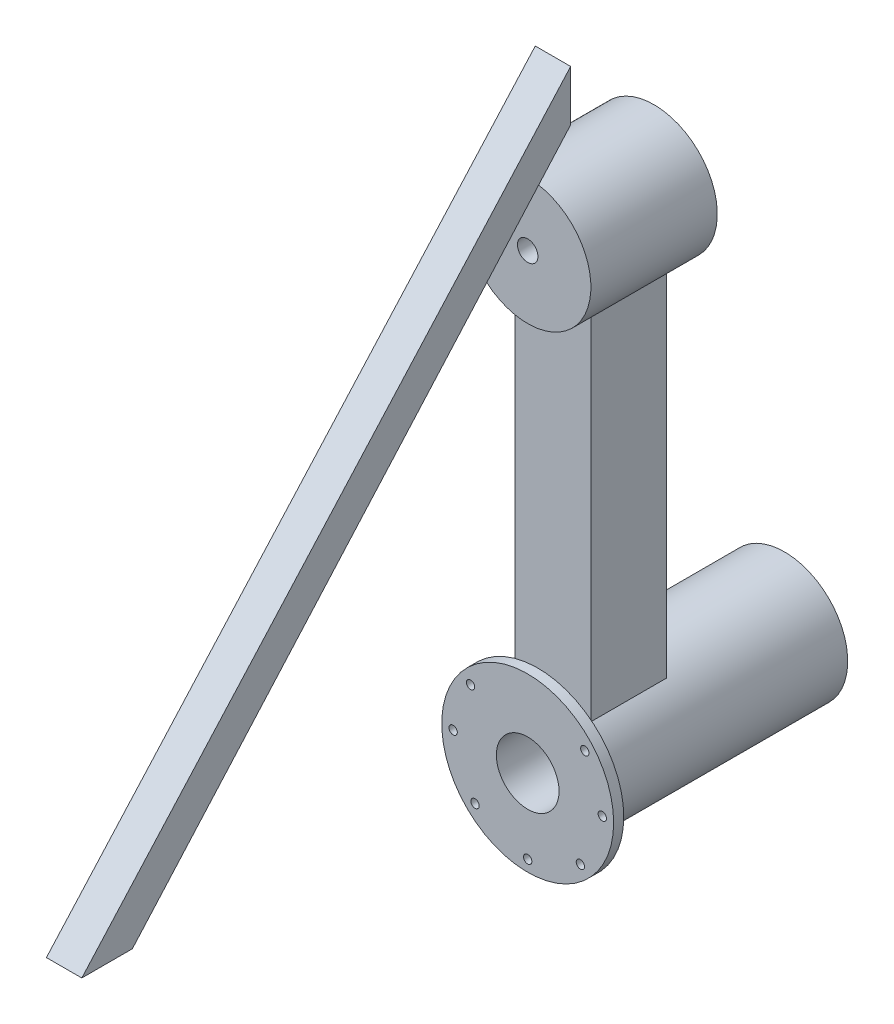
ISO-10303-21;
HEADER;
FILE_DESCRIPTION(('STEP AP214'),'2;1');
FILE_NAME('part.step','',(''),(''),'','','');
FILE_SCHEMA(('AUTOMOTIVE_DESIGN { 1 0 10303 214 1 1 1 1 }'));
ENDSEC;
DATA;
#1=APPLICATION_CONTEXT('core data for automotive mechanical design processes');
#2=APPLICATION_PROTOCOL_DEFINITION('international standard','automotive_design',2000,#1);
#3=PRODUCT_CONTEXT('',#1,'mechanical');
#4=PRODUCT('Part','Part','',(#3));
#5=PRODUCT_RELATED_PRODUCT_CATEGORY('part','',(#4));
#6=PRODUCT_DEFINITION_FORMATION('','',#4);
#7=PRODUCT_DEFINITION_CONTEXT('part definition',#1,'design');
#8=PRODUCT_DEFINITION('design','',#6,#7);
#9=PRODUCT_DEFINITION_SHAPE('','',#8);
#10=(LENGTH_UNIT() NAMED_UNIT(*) SI_UNIT(.MILLI.,.METRE.));
#11=(NAMED_UNIT(*) PLANE_ANGLE_UNIT() SI_UNIT($,.RADIAN.));
#12=(NAMED_UNIT(*) SI_UNIT($,.STERADIAN.) SOLID_ANGLE_UNIT());
#13=UNCERTAINTY_MEASURE_WITH_UNIT(LENGTH_MEASURE(1.E-05),#10,'distance_accuracy_value','');
#14=(GEOMETRIC_REPRESENTATION_CONTEXT(3) GLOBAL_UNCERTAINTY_ASSIGNED_CONTEXT((#13)) GLOBAL_UNIT_ASSIGNED_CONTEXT((#10,
#11,#12)) REPRESENTATION_CONTEXT('',''));
#15=CARTESIAN_POINT('',(0.,0.,0.));
#16=DIRECTION('',(0.,0.,1.));
#17=DIRECTION('',(1.,0.,0.));
#18=AXIS2_PLACEMENT_3D('',#15,#16,#17);
#19=CARTESIAN_POINT('',(-7.,25.,235.));
#20=DIRECTION('',(0.,-1.,0.));
#21=DIRECTION('',(0.,0.,-1.));
#22=AXIS2_PLACEMENT_3D('',#19,#20,#21);
#23=PLANE('',#22);
#24=DIRECTION('',(1.,0.,0.));
#25=VECTOR('',#24,1.);
#26=CARTESIAN_POINT('',(-7.,25.,215.));
#27=LINE('',#26,#25);
#28=CARTESIAN_POINT('',(-7.,25.,215.));
#29=VERTEX_POINT('',#28);
#30=CARTESIAN_POINT('',(7.,25.,215.));
#31=VERTEX_POINT('',#30);
#32=EDGE_CURVE('E56',#29,#31,#27,.T.);
#33=ORIENTED_EDGE('',*,*,#32,.T.);
#34=DIRECTION('',(0.,0.,-1.));
#35=VECTOR('',#34,1.);
#36=CARTESIAN_POINT('',(7.,25.,235.));
#37=LINE('',#36,#35);
#38=CARTESIAN_POINT('',(7.,25.,235.));
#39=VERTEX_POINT('',#38);
#40=EDGE_CURVE('E93',#39,#31,#37,.T.);
#41=ORIENTED_EDGE('',*,*,#40,.F.);
#42=DIRECTION('',(1.,0.,0.));
#43=VECTOR('',#42,1.);
#44=CARTESIAN_POINT('',(-7.,25.,235.));
#45=LINE('',#44,#43);
#46=CARTESIAN_POINT('',(-7.,25.,235.));
#47=VERTEX_POINT('',#46);
#48=EDGE_CURVE('E12',#47,#39,#45,.T.);
#49=ORIENTED_EDGE('',*,*,#48,.F.);
#50=DIRECTION('',(0.,0.,-1.));
#51=VECTOR('',#50,1.);
#52=CARTESIAN_POINT('',(-7.,25.,235.));
#53=LINE('',#52,#51);
#54=EDGE_CURVE('E94',#47,#29,#53,.T.);
#55=ORIENTED_EDGE('',*,*,#54,.T.);
#56=EDGE_LOOP('',(#33,#41,#49,#55));
#57=FACE_BOUND('',#56,.T.);
#58=ADVANCED_FACE('F53',(#57),#23,.T.);
#59=CARTESIAN_POINT('',(-7.,240.604607897903,41.6046078979033));
#60=DIRECTION('',(0.,0.667726277990492,0.744406889866667));
#61=DIRECTION('',(0.,-0.744406889866667,0.667726277990492));
#62=AXIS2_PLACEMENT_3D('',#59,#60,#61);
#63=PLANE('',#62);
#64=ORIENTED_EDGE('',*,*,#48,.T.);
#65=DIRECTION('',(0.,-0.744406889866667,0.667726277990492));
#66=VECTOR('',#65,1.);
#67=CARTESIAN_POINT('',(7.,240.604607897903,41.6046078979033));
#68=LINE('',#67,#66);
#69=CARTESIAN_POINT('',(7.,240.604607897903,41.6046078979033));
#70=VERTEX_POINT('',#69);
#71=EDGE_CURVE('E110',#70,#39,#68,.T.);
#72=ORIENTED_EDGE('',*,*,#71,.F.);
#73=DIRECTION('',(1.,0.,0.));
#74=VECTOR('',#73,1.);
#75=CARTESIAN_POINT('',(-7.,240.604607897903,41.6046078979033));
#76=LINE('',#75,#74);
#77=CARTESIAN_POINT('',(-7.,240.604607897903,41.6046078979033));
#78=VERTEX_POINT('',#77);
#79=EDGE_CURVE('E61',#78,#70,#76,.T.);
#80=ORIENTED_EDGE('',*,*,#79,.F.);
#81=DIRECTION('',(0.,-0.744406889866667,0.667726277990492));
#82=VECTOR('',#81,1.);
#83=CARTESIAN_POINT('',(-7.,240.604607897903,41.6046078979033));
#84=LINE('',#83,#82);
#85=EDGE_CURVE('E99',#78,#47,#84,.T.);
#86=ORIENTED_EDGE('',*,*,#85,.T.);
#87=EDGE_LOOP('',(#64,#72,#80,#86));
#88=FACE_BOUND('',#87,.T.);
#89=ADVANCED_FACE('F125',(#88),#63,.T.);
#90=CARTESIAN_POINT('',(-7.,240.604607897903,41.6046078979033));
#91=DIRECTION('',(0.,0.,-1.));
#92=DIRECTION('',(-1.,0.,0.));
#93=AXIS2_PLACEMENT_3D('',#90,#91,#92);
#94=PLANE('',#93);
#95=ORIENTED_EDGE('',*,*,#79,.T.);
#96=DIRECTION('',(0.,1.,0.));
#97=VECTOR('',#96,1.);
#98=CARTESIAN_POINT('',(7.,240.604607897903,41.6046078979033));
#99=LINE('',#98,#97);
#100=CARTESIAN_POINT('',(7.,220.604607897903,41.6046078979033));
#101=VERTEX_POINT('',#100);
#102=EDGE_CURVE('E106',#101,#70,#99,.T.);
#103=ORIENTED_EDGE('',*,*,#102,.F.);
#104=DIRECTION('',(1.,0.,0.));
#105=VECTOR('',#104,1.);
#106=CARTESIAN_POINT('',(-7.,220.604607897903,41.6046078979033));
#107=LINE('',#106,#105);
#108=CARTESIAN_POINT('',(-7.,220.604607897903,41.6046078979033));
#109=VERTEX_POINT('',#108);
#110=EDGE_CURVE('E98',#109,#101,#107,.T.);
#111=ORIENTED_EDGE('',*,*,#110,.F.);
#112=DIRECTION('',(0.,1.,0.));
#113=VECTOR('',#112,1.);
#114=CARTESIAN_POINT('',(-7.,240.604607897903,41.6046078979033));
#115=LINE('',#114,#113);
#116=EDGE_CURVE('E118',#109,#78,#115,.T.);
#117=ORIENTED_EDGE('',*,*,#116,.T.);
#118=EDGE_LOOP('',(#95,#103,#111,#117));
#119=FACE_BOUND('',#118,.T.);
#120=ADVANCED_FACE('F122',(#119),#94,.T.);
#121=CARTESIAN_POINT('',(-7.,220.604607897903,41.6046078979033));
#122=DIRECTION('',(0.,-0.663347321171446,-0.748311653988274));
#123=DIRECTION('',(0.,0.748311653988274,-0.663347321171446));
#124=AXIS2_PLACEMENT_3D('',#121,#122,#123);
#125=PLANE('',#124);
#126=ORIENTED_EDGE('',*,*,#110,.T.);
#127=DIRECTION('',(0.,0.748311653988274,-0.663347321171446));
#128=VECTOR('',#127,1.);
#129=CARTESIAN_POINT('',(7.,220.604607897903,41.6046078979033));
#130=LINE('',#129,#128);
#131=EDGE_CURVE('E101',#31,#101,#130,.T.);
#132=ORIENTED_EDGE('',*,*,#131,.F.);
#133=ORIENTED_EDGE('',*,*,#32,.F.);
#134=DIRECTION('',(0.,0.748311653988274,-0.663347321171446));
#135=VECTOR('',#134,1.);
#136=CARTESIAN_POINT('',(-7.,220.604607897903,41.6046078979033));
#137=LINE('',#136,#135);
#138=EDGE_CURVE('E116',#29,#109,#137,.T.);
#139=ORIENTED_EDGE('',*,*,#138,.T.);
#140=EDGE_LOOP('',(#126,#132,#133,#139));
#141=FACE_BOUND('',#140,.T.);
#142=ADVANCED_FACE('F102',(#141),#125,.T.);
#143=CARTESIAN_POINT('',(-7.,0.,0.));
#144=DIRECTION('',(-1.,0.,0.));
#145=DIRECTION('',(0.,0.,1.));
#146=AXIS2_PLACEMENT_3D('',#143,#144,#145);
#147=PLANE('',#146);
#148=ORIENTED_EDGE('',*,*,#54,.F.);
#149=ORIENTED_EDGE('',*,*,#85,.F.);
#150=ORIENTED_EDGE('',*,*,#116,.F.);
#151=ORIENTED_EDGE('',*,*,#138,.F.);
#152=EDGE_LOOP('',(#148,#149,#150,#151));
#153=FACE_BOUND('',#152,.T.);
#154=ADVANCED_FACE('F127',(#153),#147,.T.);
#155=CARTESIAN_POINT('',(7.,0.,0.));
#156=DIRECTION('',(-1.,0.,0.));
#157=DIRECTION('',(0.,0.,1.));
#158=AXIS2_PLACEMENT_3D('',#155,#156,#157);
#159=PLANE('',#158);
#160=ORIENTED_EDGE('',*,*,#40,.T.);
#161=ORIENTED_EDGE('',*,*,#131,.T.);
#162=ORIENTED_EDGE('',*,*,#102,.T.);
#163=ORIENTED_EDGE('',*,*,#71,.T.);
#164=EDGE_LOOP('',(#160,#161,#162,#163));
#165=FACE_BOUND('',#164,.T.);
#166=ADVANCED_FACE('F109',(#165),#159,.F.);
#167=CLOSED_SHELL('',(#58,#89,#120,#142,#154,#166));
#168=MANIFOLD_SOLID_BREP('B2_NOT_SHOWN',#167);
#169=CARTESIAN_POINT('',(0.,0.,270.));
#170=DIRECTION('',(0.,0.,-1.));
#171=DIRECTION('',(-1.,0.,0.));
#172=AXIS2_PLACEMENT_3D('',#169,#170,#171);
#173=CYLINDRICAL_SURFACE('',#172,25.);
#174=DIRECTION('',(0.,0.,-1.));
#175=VECTOR('',#174,1.);
#176=CARTESIAN_POINT('',(10.,-22.9128784747792,270.));
#177=LINE('',#176,#175);
#178=CARTESIAN_POINT('',(10.,-22.9128784747792,-14.1976960510484));
#179=VERTEX_POINT('',#178);
#180=CARTESIAN_POINT('',(10.,-22.9128784747792,-34.1976960510484));
#181=VERTEX_POINT('',#180);
#182=EDGE_CURVE('E301',#179,#181,#177,.T.);
#183=ORIENTED_EDGE('',*,*,#182,.T.);
#184=CARTESIAN_POINT('',(0.,0.,-34.1976960510484));
#185=DIRECTION('',(0.,0.,-1.));
#186=DIRECTION('',(-1.,0.,0.));
#187=AXIS2_PLACEMENT_3D('',#184,#185,#186);
#188=CIRCLE('',#187,25.);
#189=CARTESIAN_POINT('',(-9.99999999999999,-22.9128784747792,-34.1976960510484));
#190=VERTEX_POINT('',#189);
#191=EDGE_CURVE('E295',#181,#190,#188,.T.);
#192=ORIENTED_EDGE('',*,*,#191,.T.);
#193=DIRECTION('',(0.,0.,-1.));
#194=VECTOR('',#193,1.);
#195=CARTESIAN_POINT('',(-9.99999999999999,-22.9128784747792,270.));
#196=LINE('',#195,#194);
#197=CARTESIAN_POINT('',(-9.99999999999999,-22.9128784747792,-14.1976960510484));
#198=VERTEX_POINT('',#197);
#199=EDGE_CURVE('E248',#190,#198,#196,.F.);
#200=ORIENTED_EDGE('',*,*,#199,.T.);
#201=CARTESIAN_POINT('',(0.,0.,-14.1976960510484));
#202=DIRECTION('',(0.,0.,1.));
#203=DIRECTION('',(1.,0.,0.));
#204=AXIS2_PLACEMENT_3D('',#201,#202,#203);
#205=CIRCLE('',#204,25.);
#206=EDGE_CURVE('E297',#198,#179,#205,.T.);
#207=ORIENTED_EDGE('',*,*,#206,.T.);
#208=EDGE_LOOP('',(#183,#192,#200,#207));
#209=FACE_BOUND('',#208,.T.);
#210=DIRECTION('',(0.,0.,-1.));
#211=VECTOR('',#210,1.);
#212=CARTESIAN_POINT('',(14.9500000000001,20.0374025262757,270.));
#213=LINE('',#212,#211);
#214=CARTESIAN_POINT('',(14.95,20.0374025262757,41.6046078979033));
#215=VERTEX_POINT('',#214);
#216=CARTESIAN_POINT('',(14.95,20.0374025262757,11.6046078979032));
#217=VERTEX_POINT('',#216);
#218=EDGE_CURVE('E292',#215,#217,#213,.T.);
#219=ORIENTED_EDGE('',*,*,#218,.F.);
#220=CARTESIAN_POINT('',(0.,0.,41.6046078979033));
#221=DIRECTION('',(0.,0.,-1.));
#222=DIRECTION('',(-1.,0.,0.));
#223=AXIS2_PLACEMENT_3D('',#220,#221,#222);
#224=CIRCLE('',#223,25.);
#225=CARTESIAN_POINT('',(-15.05,19.9624021600608,41.6046078979033));
#226=VERTEX_POINT('',#225);
#227=EDGE_CURVE('E283',#226,#215,#224,.T.);
#228=ORIENTED_EDGE('',*,*,#227,.F.);
#229=DIRECTION('',(0.,0.,-1.));
#230=VECTOR('',#229,1.);
#231=CARTESIAN_POINT('',(-15.05,19.9624021600608,270.));
#232=LINE('',#231,#230);
#233=CARTESIAN_POINT('',(-15.05,19.9624021600608,11.6046078979032));
#234=VERTEX_POINT('',#233);
#235=EDGE_CURVE('E286',#234,#226,#232,.F.);
#236=ORIENTED_EDGE('',*,*,#235,.F.);
#237=CARTESIAN_POINT('',(0.,0.,11.6046078979032));
#238=DIRECTION('',(0.,0.,1.));
#239=DIRECTION('',(1.,0.,0.));
#240=AXIS2_PLACEMENT_3D('',#237,#238,#239);
#241=CIRCLE('',#240,25.);
#242=EDGE_CURVE('E289',#217,#234,#241,.T.);
#243=ORIENTED_EDGE('',*,*,#242,.F.);
#244=EDGE_LOOP('',(#219,#228,#236,#243));
#245=FACE_BOUND('',#244,.T.);
#246=CARTESIAN_POINT('',(0.,0.,-50.));
#247=DIRECTION('',(0.,0.,-1.));
#248=DIRECTION('',(-1.,0.,0.));
#249=AXIS2_PLACEMENT_3D('',#246,#247,#248);
#250=CIRCLE('',#249,25.);
#251=CARTESIAN_POINT('',(-25.,0.,-50.));
#252=VERTEX_POINT('',#251);
#253=EDGE_CURVE('E276',#252,#252,#250,.T.);
#254=ORIENTED_EDGE('',*,*,#253,.F.);
#255=EDGE_LOOP('',(#254));
#256=FACE_BOUND('',#255,.T.);
#257=CARTESIAN_POINT('',(0.,0.,47.6));
#258=DIRECTION('',(0.,0.,1.));
#259=DIRECTION('',(1.,0.,0.));
#260=AXIS2_PLACEMENT_3D('',#257,#258,#259);
#261=CIRCLE('',#260,25.);
#262=CARTESIAN_POINT('',(25.,0.,47.6));
#263=VERTEX_POINT('',#262);
#264=EDGE_CURVE('E51',#263,#263,#261,.T.);
#265=ORIENTED_EDGE('',*,*,#264,.F.);
#266=EDGE_LOOP('',(#265));
#267=FACE_BOUND('',#266,.T.);
#268=ADVANCED_FACE('F177',(#209,#245,#256,#267),#173,.T.);
#269=CARTESIAN_POINT('',(0.,179.,51.6046078979032));
#270=DIRECTION('',(0.,0.,-1.));
#271=DIRECTION('',(-1.,0.,0.));
#272=AXIS2_PLACEMENT_3D('',#269,#270,#271);
#273=CYLINDRICAL_SURFACE('',#272,25.);
#274=CARTESIAN_POINT('',(0.,179.,51.6046078979032));
#275=DIRECTION('',(0.,0.,-1.));
#276=DIRECTION('',(-1.,0.,0.));
#277=AXIS2_PLACEMENT_3D('',#274,#275,#276);
#278=CIRCLE('',#277,25.);
#279=CARTESIAN_POINT('',(-25.,179.,51.6046078979032));
#280=VERTEX_POINT('',#279);
#281=EDGE_CURVE('E185',#280,#280,#278,.T.);
#282=ORIENTED_EDGE('',*,*,#281,.T.);
#283=EDGE_LOOP('',(#282));
#284=FACE_BOUND('',#283,.T.);
#285=CARTESIAN_POINT('',(0.,179.,1.60460789790325));
#286=DIRECTION('',(0.,0.,-1.));
#287=DIRECTION('',(-1.,0.,0.));
#288=AXIS2_PLACEMENT_3D('',#285,#286,#287);
#289=CIRCLE('',#288,25.);
#290=CARTESIAN_POINT('',(-25.,179.,1.60460789790325));
#291=VERTEX_POINT('',#290);
#292=EDGE_CURVE('E320',#291,#291,#289,.T.);
#293=ORIENTED_EDGE('',*,*,#292,.F.);
#294=EDGE_LOOP('',(#293));
#295=FACE_BOUND('',#294,.T.);
#296=DIRECTION('',(0.,0.,-1.));
#297=VECTOR('',#296,1.);
#298=CARTESIAN_POINT('',(-15.05,159.037597839939,41.6046078979033));
#299=LINE('',#298,#297);
#300=CARTESIAN_POINT('',(-15.05,159.037597839939,41.6046078979033));
#301=VERTEX_POINT('',#300);
#302=CARTESIAN_POINT('',(-15.05,159.037597839939,11.6046078979033));
#303=VERTEX_POINT('',#302);
#304=EDGE_CURVE('E197',#301,#303,#299,.T.);
#305=ORIENTED_EDGE('',*,*,#304,.F.);
#306=CARTESIAN_POINT('',(0.,179.,41.6046078979033));
#307=DIRECTION('',(0.,0.,1.));
#308=DIRECTION('',(-1.,0.,0.));
#309=AXIS2_PLACEMENT_3D('',#306,#307,#308);
#310=CIRCLE('',#309,25.);
#311=CARTESIAN_POINT('',(14.95,158.962597473724,41.6046078979033));
#312=VERTEX_POINT('',#311);
#313=EDGE_CURVE('E192',#301,#312,#310,.T.);
#314=ORIENTED_EDGE('',*,*,#313,.T.);
#315=DIRECTION('',(0.,0.,-1.));
#316=VECTOR('',#315,1.);
#317=CARTESIAN_POINT('',(14.95,158.962597473724,41.6046078979033));
#318=LINE('',#317,#316);
#319=CARTESIAN_POINT('',(14.95,158.962597473724,11.6046078979033));
#320=VERTEX_POINT('',#319);
#321=EDGE_CURVE('E318',#312,#320,#318,.T.);
#322=ORIENTED_EDGE('',*,*,#321,.T.);
#323=CARTESIAN_POINT('',(0.,179.,11.6046078979033));
#324=DIRECTION('',(0.,0.,1.));
#325=DIRECTION('',(-1.,0.,0.));
#326=AXIS2_PLACEMENT_3D('',#323,#324,#325);
#327=CIRCLE('',#326,25.);
#328=EDGE_CURVE('E314',#303,#320,#327,.T.);
#329=ORIENTED_EDGE('',*,*,#328,.F.);
#330=EDGE_LOOP('',(#305,#314,#322,#329));
#331=FACE_BOUND('',#330,.T.);
#332=ADVANCED_FACE('F179',(#284,#295,#331),#273,.T.);
#333=CARTESIAN_POINT('',(0.,179.,51.6046078979032));
#334=DIRECTION('',(0.,0.,-1.));
#335=DIRECTION('',(-1.,0.,0.));
#336=AXIS2_PLACEMENT_3D('',#333,#334,#335);
#337=PLANE('',#336);
#338=CARTESIAN_POINT('',(0.,179.,51.6046078979032));
#339=DIRECTION('',(0.,0.,-1.));
#340=DIRECTION('',(-1.,0.,0.));
#341=AXIS2_PLACEMENT_3D('',#338,#339,#340);
#342=CIRCLE('',#341,4.05);
#343=CARTESIAN_POINT('',(-4.05,179.,51.6046078979032));
#344=VERTEX_POINT('',#343);
#345=EDGE_CURVE('E395',#344,#344,#342,.T.);
#346=ORIENTED_EDGE('',*,*,#345,.T.);
#347=EDGE_LOOP('',(#346));
#348=FACE_BOUND('',#347,.T.);
#349=ORIENTED_EDGE('',*,*,#281,.F.);
#350=EDGE_LOOP('',(#349));
#351=FACE_BOUND('',#350,.T.);
#352=ADVANCED_FACE('F328',(#348,#351),#337,.F.);
#353=CARTESIAN_POINT('',(0.,179.,1.60460789790325));
#354=DIRECTION('',(0.,0.,-1.));
#355=DIRECTION('',(-1.,0.,0.));
#356=AXIS2_PLACEMENT_3D('',#353,#354,#355);
#357=PLANE('',#356);
#358=CARTESIAN_POINT('',(0.,179.,1.60460789790325));
#359=DIRECTION('',(0.,0.,-1.));
#360=DIRECTION('',(-1.,0.,0.));
#361=AXIS2_PLACEMENT_3D('',#358,#359,#360);
#362=CIRCLE('',#361,4.05);
#363=CARTESIAN_POINT('',(-4.05,179.,1.60460789790325));
#364=VERTEX_POINT('',#363);
#365=EDGE_CURVE('E391',#364,#364,#362,.T.);
#366=ORIENTED_EDGE('',*,*,#365,.F.);
#367=EDGE_LOOP('',(#366));
#368=FACE_BOUND('',#367,.T.);
#369=ORIENTED_EDGE('',*,*,#292,.T.);
#370=EDGE_LOOP('',(#369));
#371=FACE_BOUND('',#370,.T.);
#372=ADVANCED_FACE('F330',(#368,#371),#357,.T.);
#373=CARTESIAN_POINT('',(14.95,150.,41.6046078979033));
#374=DIRECTION('',(1.,0.,0.));
#375=DIRECTION('',(0.,0.,-1.));
#376=AXIS2_PLACEMENT_3D('',#373,#374,#375);
#377=PLANE('',#376);
#378=DIRECTION('',(0.,-1.,0.));
#379=VECTOR('',#378,1.);
#380=CARTESIAN_POINT('',(14.95,150.,11.6046078979033));
#381=LINE('',#380,#379);
#382=EDGE_CURVE('E308',#320,#217,#381,.T.);
#383=ORIENTED_EDGE('',*,*,#382,.F.);
#384=ORIENTED_EDGE('',*,*,#321,.F.);
#385=DIRECTION('',(0.,-1.,0.));
#386=VECTOR('',#385,1.);
#387=CARTESIAN_POINT('',(14.95,150.,41.6046078979033));
#388=LINE('',#387,#386);
#389=EDGE_CURVE('E310',#312,#215,#388,.T.);
#390=ORIENTED_EDGE('',*,*,#389,.T.);
#391=ORIENTED_EDGE('',*,*,#218,.T.);
#392=EDGE_LOOP('',(#383,#384,#390,#391));
#393=FACE_BOUND('',#392,.T.);
#394=ADVANCED_FACE('F336',(#393),#377,.T.);
#395=CARTESIAN_POINT('',(-15.05,150.,41.6046078979033));
#396=DIRECTION('',(-1.,0.,0.));
#397=DIRECTION('',(0.,-1.,0.));
#398=AXIS2_PLACEMENT_3D('',#395,#396,#397);
#399=PLANE('',#398);
#400=DIRECTION('',(0.,1.,0.));
#401=VECTOR('',#400,1.);
#402=CARTESIAN_POINT('',(-15.05,150.,11.6046078979033));
#403=LINE('',#402,#401);
#404=EDGE_CURVE('E304',#234,#303,#403,.T.);
#405=ORIENTED_EDGE('',*,*,#404,.F.);
#406=ORIENTED_EDGE('',*,*,#235,.T.);
#407=DIRECTION('',(0.,1.,0.));
#408=VECTOR('',#407,1.);
#409=CARTESIAN_POINT('',(-15.05,150.,41.6046078979033));
#410=LINE('',#409,#408);
#411=EDGE_CURVE('E305',#226,#301,#410,.T.);
#412=ORIENTED_EDGE('',*,*,#411,.T.);
#413=ORIENTED_EDGE('',*,*,#304,.T.);
#414=EDGE_LOOP('',(#405,#406,#412,#413));
#415=FACE_BOUND('',#414,.T.);
#416=ADVANCED_FACE('F357',(#415),#399,.T.);
#417=CARTESIAN_POINT('',(0.,179.,41.6046078979033));
#418=DIRECTION('',(0.,0.,-1.));
#419=DIRECTION('',(-1.,0.,0.));
#420=AXIS2_PLACEMENT_3D('',#417,#418,#419);
#421=PLANE('',#420);
#422=ORIENTED_EDGE('',*,*,#411,.F.);
#423=ORIENTED_EDGE('',*,*,#227,.T.);
#424=ORIENTED_EDGE('',*,*,#389,.F.);
#425=ORIENTED_EDGE('',*,*,#313,.F.);
#426=EDGE_LOOP('',(#422,#423,#424,#425));
#427=FACE_BOUND('',#426,.T.);
#428=ADVANCED_FACE('F353',(#427),#421,.F.);
#429=CARTESIAN_POINT('',(0.,179.,11.6046078979033));
#430=DIRECTION('',(0.,0.,-1.));
#431=DIRECTION('',(-1.,0.,0.));
#432=AXIS2_PLACEMENT_3D('',#429,#430,#431);
#433=PLANE('',#432);
#434=ORIENTED_EDGE('',*,*,#382,.T.);
#435=ORIENTED_EDGE('',*,*,#242,.T.);
#436=ORIENTED_EDGE('',*,*,#404,.T.);
#437=ORIENTED_EDGE('',*,*,#328,.T.);
#438=EDGE_LOOP('',(#434,#435,#436,#437));
#439=FACE_BOUND('',#438,.T.);
#440=ADVANCED_FACE('F356',(#439),#433,.T.);
#441=CARTESIAN_POINT('',(0.,0.,-50.));
#442=DIRECTION('',(0.,0.,-1.));
#443=DIRECTION('',(-1.,0.,0.));
#444=AXIS2_PLACEMENT_3D('',#441,#442,#443);
#445=PLANE('',#444);
#446=ORIENTED_EDGE('',*,*,#253,.T.);
#447=EDGE_LOOP('',(#446));
#448=FACE_BOUND('',#447,.T.);
#449=ADVANCED_FACE('F351',(#448),#445,.T.);
#450=CARTESIAN_POINT('',(-9.99999999999999,-5.,-14.1976960510484));
#451=DIRECTION('',(-1.,0.,0.));
#452=DIRECTION('',(0.,0.,1.));
#453=AXIS2_PLACEMENT_3D('',#450,#451,#452);
#454=PLANE('',#453);
#455=DIRECTION('',(0.,-1.,0.));
#456=VECTOR('',#455,1.);
#457=CARTESIAN_POINT('',(-9.99999999999999,-5.,-34.1976960510484));
#458=LINE('',#457,#456);
#459=CARTESIAN_POINT('',(-9.99999999999999,-5.,-34.1976960510484));
#460=VERTEX_POINT('',#459);
#461=EDGE_CURVE('E240',#460,#190,#458,.T.);
#462=ORIENTED_EDGE('',*,*,#461,.F.);
#463=DIRECTION('',(0.,0.,-1.));
#464=VECTOR('',#463,1.);
#465=CARTESIAN_POINT('',(-9.99999999999999,-5.,-14.1976960510484));
#466=LINE('',#465,#464);
#467=CARTESIAN_POINT('',(-9.99999999999999,-5.,-14.1976960510484));
#468=VERTEX_POINT('',#467);
#469=EDGE_CURVE('E245',#468,#460,#466,.T.);
#470=ORIENTED_EDGE('',*,*,#469,.F.);
#471=DIRECTION('',(0.,-1.,0.));
#472=VECTOR('',#471,1.);
#473=CARTESIAN_POINT('',(-9.99999999999999,-5.,-14.1976960510484));
#474=LINE('',#473,#472);
#475=EDGE_CURVE('E274',#468,#198,#474,.T.);
#476=ORIENTED_EDGE('',*,*,#475,.T.);
#477=ORIENTED_EDGE('',*,*,#199,.F.);
#478=EDGE_LOOP('',(#462,#470,#476,#477));
#479=FACE_BOUND('',#478,.T.);
#480=ADVANCED_FACE('F242',(#479),#454,.F.);
#481=CARTESIAN_POINT('',(10.,-5.,-14.1976960510484));
#482=DIRECTION('',(0.,0.,1.));
#483=DIRECTION('',(1.,0.,0.));
#484=AXIS2_PLACEMENT_3D('',#481,#482,#483);
#485=PLANE('',#484);
#486=ORIENTED_EDGE('',*,*,#475,.F.);
#487=DIRECTION('',(-1.,0.,0.));
#488=VECTOR('',#487,1.);
#489=CARTESIAN_POINT('',(10.,-5.,-14.1976960510484));
#490=LINE('',#489,#488);
#491=CARTESIAN_POINT('',(10.,-5.,-14.1976960510484));
#492=VERTEX_POINT('',#491);
#493=EDGE_CURVE('E252',#492,#468,#490,.T.);
#494=ORIENTED_EDGE('',*,*,#493,.F.);
#495=DIRECTION('',(0.,-1.,0.));
#496=VECTOR('',#495,1.);
#497=CARTESIAN_POINT('',(10.,-5.,-14.1976960510484));
#498=LINE('',#497,#496);
#499=EDGE_CURVE('E277',#492,#179,#498,.T.);
#500=ORIENTED_EDGE('',*,*,#499,.T.);
#501=ORIENTED_EDGE('',*,*,#206,.F.);
#502=EDGE_LOOP('',(#486,#494,#500,#501));
#503=FACE_BOUND('',#502,.T.);
#504=ADVANCED_FACE('F460',(#503),#485,.F.);
#505=CARTESIAN_POINT('',(10.,-5.,-14.1976960510484));
#506=DIRECTION('',(1.,0.,0.));
#507=DIRECTION('',(0.,0.,-1.));
#508=AXIS2_PLACEMENT_3D('',#505,#506,#507);
#509=PLANE('',#508);
#510=ORIENTED_EDGE('',*,*,#499,.F.);
#511=DIRECTION('',(0.,0.,1.));
#512=VECTOR('',#511,1.);
#513=CARTESIAN_POINT('',(10.,-5.,-14.1976960510484));
#514=LINE('',#513,#512);
#515=CARTESIAN_POINT('',(10.,-5.,-34.1976960510484));
#516=VERTEX_POINT('',#515);
#517=EDGE_CURVE('E261',#516,#492,#514,.T.);
#518=ORIENTED_EDGE('',*,*,#517,.F.);
#519=DIRECTION('',(0.,-1.,0.));
#520=VECTOR('',#519,1.);
#521=CARTESIAN_POINT('',(10.,-5.,-34.1976960510484));
#522=LINE('',#521,#520);
#523=EDGE_CURVE('E251',#516,#181,#522,.T.);
#524=ORIENTED_EDGE('',*,*,#523,.T.);
#525=ORIENTED_EDGE('',*,*,#182,.F.);
#526=EDGE_LOOP('',(#510,#518,#524,#525));
#527=FACE_BOUND('',#526,.T.);
#528=ADVANCED_FACE('F463',(#527),#509,.F.);
#529=CARTESIAN_POINT('',(10.,-5.,-34.1976960510484));
#530=DIRECTION('',(0.,0.,-1.));
#531=DIRECTION('',(-1.,0.,0.));
#532=AXIS2_PLACEMENT_3D('',#529,#530,#531);
#533=PLANE('',#532);
#534=ORIENTED_EDGE('',*,*,#523,.F.);
#535=DIRECTION('',(1.,0.,0.));
#536=VECTOR('',#535,1.);
#537=CARTESIAN_POINT('',(10.,-5.,-34.1976960510484));
#538=LINE('',#537,#536);
#539=EDGE_CURVE('E255',#460,#516,#538,.T.);
#540=ORIENTED_EDGE('',*,*,#539,.F.);
#541=ORIENTED_EDGE('',*,*,#461,.T.);
#542=ORIENTED_EDGE('',*,*,#191,.F.);
#543=EDGE_LOOP('',(#534,#540,#541,#542));
#544=FACE_BOUND('',#543,.T.);
#545=ADVANCED_FACE('F256',(#544),#533,.F.);
#546=CARTESIAN_POINT('',(0.,-5.,0.));
#547=DIRECTION('',(0.,1.,0.));
#548=DIRECTION('',(0.,0.,1.));
#549=AXIS2_PLACEMENT_3D('',#546,#547,#548);
#550=PLANE('',#549);
#551=ORIENTED_EDGE('',*,*,#469,.T.);
#552=ORIENTED_EDGE('',*,*,#539,.T.);
#553=ORIENTED_EDGE('',*,*,#517,.T.);
#554=ORIENTED_EDGE('',*,*,#493,.T.);
#555=EDGE_LOOP('',(#551,#552,#553,#554));
#556=FACE_BOUND('',#555,.T.);
#557=ADVANCED_FACE('F263',(#556),#550,.F.);
#558=CARTESIAN_POINT('',(0.,179.,61.6046078979033));
#559=DIRECTION('',(0.,0.,-1.));
#560=DIRECTION('',(-1.,0.,0.));
#561=AXIS2_PLACEMENT_3D('',#558,#559,#560);
#562=CYLINDRICAL_SURFACE('',#561,4.05);
#563=ORIENTED_EDGE('',*,*,#365,.T.);
#564=EDGE_LOOP('',(#563));
#565=FACE_BOUND('',#564,.T.);
#566=ORIENTED_EDGE('',*,*,#345,.F.);
#567=EDGE_LOOP('',(#566));
#568=FACE_BOUND('',#567,.T.);
#569=ADVANCED_FACE('F443',(#565,#568),#562,.F.);
#570=CARTESIAN_POINT('',(0.,0.,47.6));
#571=DIRECTION('',(0.,0.,1.));
#572=DIRECTION('',(1.,0.,0.));
#573=AXIS2_PLACEMENT_3D('',#570,#571,#572);
#574=CYLINDRICAL_SURFACE('',#573,34.);
#575=CARTESIAN_POINT('',(0.,0.,47.6));
#576=DIRECTION('',(0.,0.,1.));
#577=DIRECTION('',(1.,0.,0.));
#578=AXIS2_PLACEMENT_3D('',#575,#576,#577);
#579=CIRCLE('',#578,34.);
#580=CARTESIAN_POINT('',(34.,0.,47.6));
#581=VERTEX_POINT('',#580);
#582=EDGE_CURVE('E389',#581,#581,#579,.T.);
#583=ORIENTED_EDGE('',*,*,#582,.T.);
#584=EDGE_LOOP('',(#583));
#585=FACE_BOUND('',#584,.T.);
#586=CARTESIAN_POINT('',(0.,0.,51.6));
#587=DIRECTION('',(0.,0.,1.));
#588=DIRECTION('',(1.,0.,0.));
#589=AXIS2_PLACEMENT_3D('',#586,#587,#588);
#590=CIRCLE('',#589,34.);
#591=CARTESIAN_POINT('',(34.,0.,51.6));
#592=VERTEX_POINT('',#591);
#593=EDGE_CURVE('E392',#592,#592,#590,.T.);
#594=ORIENTED_EDGE('',*,*,#593,.F.);
#595=EDGE_LOOP('',(#594));
#596=FACE_BOUND('',#595,.T.);
#597=ADVANCED_FACE('F384',(#585,#596),#574,.T.);
#598=CARTESIAN_POINT('',(0.,0.,47.6));
#599=DIRECTION('',(0.,0.,1.));
#600=DIRECTION('',(1.,0.,0.));
#601=AXIS2_PLACEMENT_3D('',#598,#599,#600);
#602=PLANE('',#601);
#603=CARTESIAN_POINT('',(22.5983110720098,18.9622344857529,47.6));
#604=DIRECTION('',(0.,0.,1.));
#605=DIRECTION('',(-1.,0.,0.));
#606=AXIS2_PLACEMENT_3D('',#603,#604,#605);
#607=CIRCLE('',#606,1.65);
#608=CARTESIAN_POINT('',(20.9483110720098,18.9622344857529,47.6));
#609=VERTEX_POINT('',#608);
#610=EDGE_CURVE('E675',#609,#609,#607,.T.);
#611=ORIENTED_EDGE('',*,*,#610,.T.);
#612=EDGE_LOOP('',(#611));
#613=FACE_BOUND('',#612,.T.);
#614=CARTESIAN_POINT('',(29.5,0.,47.6));
#615=DIRECTION('',(0.,0.,1.));
#616=DIRECTION('',(-1.,0.,0.));
#617=AXIS2_PLACEMENT_3D('',#614,#615,#616);
#618=CIRCLE('',#617,1.65);
#619=CARTESIAN_POINT('',(27.85,0.,47.6));
#620=VERTEX_POINT('',#619);
#621=EDGE_CURVE('E679',#620,#620,#618,.T.);
#622=ORIENTED_EDGE('',*,*,#621,.T.);
#623=EDGE_LOOP('',(#622));
#624=FACE_BOUND('',#623,.T.);
#625=CARTESIAN_POINT('',(20.8394453124158,-20.8394453124159,47.6));
#626=DIRECTION('',(0.,0.,1.));
#627=DIRECTION('',(-1.,0.,0.));
#628=AXIS2_PLACEMENT_3D('',#625,#626,#627);
#629=CIRCLE('',#628,1.65);
#630=CARTESIAN_POINT('',(19.1894453124158,-20.8394453124159,47.6));
#631=VERTEX_POINT('',#630);
#632=EDGE_CURVE('E683',#631,#631,#629,.T.);
#633=ORIENTED_EDGE('',*,*,#632,.T.);
#634=EDGE_LOOP('',(#633));
#635=FACE_BOUND('',#634,.T.);
#636=CARTESIAN_POINT('',(0.,-29.5,47.6));
#637=DIRECTION('',(0.,0.,1.));
#638=DIRECTION('',(1.,0.,0.));
#639=AXIS2_PLACEMENT_3D('',#636,#637,#638);
#640=CIRCLE('',#639,1.65);
#641=CARTESIAN_POINT('',(1.65,-29.5,47.6));
#642=VERTEX_POINT('',#641);
#643=EDGE_CURVE('E687',#642,#642,#640,.T.);
#644=ORIENTED_EDGE('',*,*,#643,.T.);
#645=EDGE_LOOP('',(#644));
#646=FACE_BOUND('',#645,.T.);
#647=CARTESIAN_POINT('',(-20.8394453124158,-20.8394453124159,47.6));
#648=DIRECTION('',(0.,0.,1.));
#649=DIRECTION('',(1.,0.,0.));
#650=AXIS2_PLACEMENT_3D('',#647,#648,#649);
#651=CIRCLE('',#650,1.65);
#652=CARTESIAN_POINT('',(-19.1894453124158,-20.8394453124159,47.6));
#653=VERTEX_POINT('',#652);
#654=EDGE_CURVE('E691',#653,#653,#651,.T.);
#655=ORIENTED_EDGE('',*,*,#654,.T.);
#656=EDGE_LOOP('',(#655));
#657=FACE_BOUND('',#656,.T.);
#658=CARTESIAN_POINT('',(-29.5,0.,47.6));
#659=DIRECTION('',(0.,0.,1.));
#660=DIRECTION('',(1.,0.,0.));
#661=AXIS2_PLACEMENT_3D('',#658,#659,#660);
#662=CIRCLE('',#661,1.65);
#663=CARTESIAN_POINT('',(-27.85,0.,47.6));
#664=VERTEX_POINT('',#663);
#665=EDGE_CURVE('E695',#664,#664,#662,.T.);
#666=ORIENTED_EDGE('',*,*,#665,.T.);
#667=EDGE_LOOP('',(#666));
#668=FACE_BOUND('',#667,.T.);
#669=CARTESIAN_POINT('',(-22.5983110720098,18.9622344857529,47.6));
#670=DIRECTION('',(0.,0.,1.));
#671=DIRECTION('',(1.,0.,0.));
#672=AXIS2_PLACEMENT_3D('',#669,#670,#671);
#673=CIRCLE('',#672,1.65);
#674=CARTESIAN_POINT('',(-20.9483110720098,18.9622344857529,47.6));
#675=VERTEX_POINT('',#674);
#676=EDGE_CURVE('E398',#675,#675,#673,.T.);
#677=ORIENTED_EDGE('',*,*,#676,.T.);
#678=EDGE_LOOP('',(#677));
#679=FACE_BOUND('',#678,.T.);
#680=ORIENTED_EDGE('',*,*,#264,.T.);
#681=EDGE_LOOP('',(#680));
#682=FACE_BOUND('',#681,.T.);
#683=ORIENTED_EDGE('',*,*,#582,.F.);
#684=EDGE_LOOP('',(#683));
#685=FACE_BOUND('',#684,.T.);
#686=ADVANCED_FACE('F380',(#613,#624,#635,#646,#657,#668,#679,#682,#685),#602,.F.);
#687=CARTESIAN_POINT('',(-22.5983110720098,18.9622344857529,47.6));
#688=DIRECTION('',(0.,0.,1.));
#689=DIRECTION('',(1.,0.,0.));
#690=AXIS2_PLACEMENT_3D('',#687,#688,#689);
#691=CYLINDRICAL_SURFACE('',#690,1.65);
#692=ORIENTED_EDGE('',*,*,#676,.F.);
#693=EDGE_LOOP('',(#692));
#694=FACE_BOUND('',#693,.T.);
#695=CARTESIAN_POINT('',(-22.5983110720098,18.9622344857529,51.6));
#696=DIRECTION('',(0.,0.,1.));
#697=DIRECTION('',(1.,0.,0.));
#698=AXIS2_PLACEMENT_3D('',#695,#696,#697);
#699=CIRCLE('',#698,1.65);
#700=CARTESIAN_POINT('',(-20.9483110720098,18.9622344857529,51.6));
#701=VERTEX_POINT('',#700);
#702=EDGE_CURVE('E401',#701,#701,#699,.T.);
#703=ORIENTED_EDGE('',*,*,#702,.T.);
#704=EDGE_LOOP('',(#703));
#705=FACE_BOUND('',#704,.T.);
#706=ADVANCED_FACE('F383',(#694,#705),#691,.F.);
#707=CARTESIAN_POINT('',(-29.5,0.,47.6));
#708=DIRECTION('',(0.,0.,1.));
#709=DIRECTION('',(1.,0.,0.));
#710=AXIS2_PLACEMENT_3D('',#707,#708,#709);
#711=CYLINDRICAL_SURFACE('',#710,1.65);
#712=ORIENTED_EDGE('',*,*,#665,.F.);
#713=EDGE_LOOP('',(#712));
#714=FACE_BOUND('',#713,.T.);
#715=CARTESIAN_POINT('',(-29.5,0.,51.6));
#716=DIRECTION('',(0.,0.,1.));
#717=DIRECTION('',(1.,0.,0.));
#718=AXIS2_PLACEMENT_3D('',#715,#716,#717);
#719=CIRCLE('',#718,1.65);
#720=CARTESIAN_POINT('',(-27.85,0.,51.6));
#721=VERTEX_POINT('',#720);
#722=EDGE_CURVE('E437',#721,#721,#719,.T.);
#723=ORIENTED_EDGE('',*,*,#722,.T.);
#724=EDGE_LOOP('',(#723));
#725=FACE_BOUND('',#724,.T.);
#726=ADVANCED_FACE('F522',(#714,#725),#711,.F.);
#727=CARTESIAN_POINT('',(-20.8394453124158,-20.8394453124159,47.6));
#728=DIRECTION('',(0.,0.,1.));
#729=DIRECTION('',(1.,0.,0.));
#730=AXIS2_PLACEMENT_3D('',#727,#728,#729);
#731=CYLINDRICAL_SURFACE('',#730,1.65);
#732=ORIENTED_EDGE('',*,*,#654,.F.);
#733=EDGE_LOOP('',(#732));
#734=FACE_BOUND('',#733,.T.);
#735=CARTESIAN_POINT('',(-20.8394453124158,-20.8394453124159,51.6));
#736=DIRECTION('',(0.,0.,1.));
#737=DIRECTION('',(1.,0.,0.));
#738=AXIS2_PLACEMENT_3D('',#735,#736,#737);
#739=CIRCLE('',#738,1.65);
#740=CARTESIAN_POINT('',(-19.1894453124158,-20.8394453124159,51.6));
#741=VERTEX_POINT('',#740);
#742=EDGE_CURVE('E433',#741,#741,#739,.T.);
#743=ORIENTED_EDGE('',*,*,#742,.T.);
#744=EDGE_LOOP('',(#743));
#745=FACE_BOUND('',#744,.T.);
#746=ADVANCED_FACE('F531',(#734,#745),#731,.F.);
#747=CARTESIAN_POINT('',(0.,-29.5,47.6));
#748=DIRECTION('',(0.,0.,1.));
#749=DIRECTION('',(1.,0.,0.));
#750=AXIS2_PLACEMENT_3D('',#747,#748,#749);
#751=CYLINDRICAL_SURFACE('',#750,1.65);
#752=ORIENTED_EDGE('',*,*,#643,.F.);
#753=EDGE_LOOP('',(#752));
#754=FACE_BOUND('',#753,.T.);
#755=CARTESIAN_POINT('',(0.,-29.5,51.6));
#756=DIRECTION('',(0.,0.,1.));
#757=DIRECTION('',(1.,0.,0.));
#758=AXIS2_PLACEMENT_3D('',#755,#756,#757);
#759=CIRCLE('',#758,1.65);
#760=CARTESIAN_POINT('',(1.65,-29.5,51.6));
#761=VERTEX_POINT('',#760);
#762=EDGE_CURVE('E429',#761,#761,#759,.T.);
#763=ORIENTED_EDGE('',*,*,#762,.T.);
#764=EDGE_LOOP('',(#763));
#765=FACE_BOUND('',#764,.T.);
#766=ADVANCED_FACE('F541',(#754,#765),#751,.F.);
#767=CARTESIAN_POINT('',(20.8394453124158,-20.8394453124159,47.6));
#768=DIRECTION('',(0.,0.,1.));
#769=DIRECTION('',(1.,0.,0.));
#770=AXIS2_PLACEMENT_3D('',#767,#768,#769);
#771=CYLINDRICAL_SURFACE('',#770,1.65);
#772=ORIENTED_EDGE('',*,*,#632,.F.);
#773=EDGE_LOOP('',(#772));
#774=FACE_BOUND('',#773,.T.);
#775=CARTESIAN_POINT('',(20.8394453124158,-20.8394453124159,51.6));
#776=DIRECTION('',(0.,0.,1.));
#777=DIRECTION('',(-1.,0.,0.));
#778=AXIS2_PLACEMENT_3D('',#775,#776,#777);
#779=CIRCLE('',#778,1.65);
#780=CARTESIAN_POINT('',(19.1894453124158,-20.8394453124159,51.6));
#781=VERTEX_POINT('',#780);
#782=EDGE_CURVE('E425',#781,#781,#779,.T.);
#783=ORIENTED_EDGE('',*,*,#782,.T.);
#784=EDGE_LOOP('',(#783));
#785=FACE_BOUND('',#784,.T.);
#786=ADVANCED_FACE('F551',(#774,#785),#771,.F.);
#787=CARTESIAN_POINT('',(29.5,0.,47.6));
#788=DIRECTION('',(0.,0.,1.));
#789=DIRECTION('',(1.,0.,0.));
#790=AXIS2_PLACEMENT_3D('',#787,#788,#789);
#791=CYLINDRICAL_SURFACE('',#790,1.65);
#792=ORIENTED_EDGE('',*,*,#621,.F.);
#793=EDGE_LOOP('',(#792));
#794=FACE_BOUND('',#793,.T.);
#795=CARTESIAN_POINT('',(29.5,0.,51.6));
#796=DIRECTION('',(0.,0.,1.));
#797=DIRECTION('',(-1.,0.,0.));
#798=AXIS2_PLACEMENT_3D('',#795,#796,#797);
#799=CIRCLE('',#798,1.65);
#800=CARTESIAN_POINT('',(27.85,0.,51.6));
#801=VERTEX_POINT('',#800);
#802=EDGE_CURVE('E421',#801,#801,#799,.T.);
#803=ORIENTED_EDGE('',*,*,#802,.T.);
#804=EDGE_LOOP('',(#803));
#805=FACE_BOUND('',#804,.T.);
#806=ADVANCED_FACE('F561',(#794,#805),#791,.F.);
#807=CARTESIAN_POINT('',(22.5983110720098,18.9622344857529,47.6));
#808=DIRECTION('',(0.,0.,1.));
#809=DIRECTION('',(1.,0.,0.));
#810=AXIS2_PLACEMENT_3D('',#807,#808,#809);
#811=CYLINDRICAL_SURFACE('',#810,1.65);
#812=ORIENTED_EDGE('',*,*,#610,.F.);
#813=EDGE_LOOP('',(#812));
#814=FACE_BOUND('',#813,.T.);
#815=CARTESIAN_POINT('',(22.5983110720098,18.9622344857529,51.6));
#816=DIRECTION('',(0.,0.,1.));
#817=DIRECTION('',(-1.,0.,0.));
#818=AXIS2_PLACEMENT_3D('',#815,#816,#817);
#819=CIRCLE('',#818,1.65);
#820=CARTESIAN_POINT('',(20.9483110720098,18.9622344857529,51.6));
#821=VERTEX_POINT('',#820);
#822=EDGE_CURVE('E417',#821,#821,#819,.T.);
#823=ORIENTED_EDGE('',*,*,#822,.T.);
#824=EDGE_LOOP('',(#823));
#825=FACE_BOUND('',#824,.T.);
#826=ADVANCED_FACE('F453',(#814,#825),#811,.F.);
#827=CARTESIAN_POINT('',(0.,0.,21.5));
#828=DIRECTION('',(0.,0.,1.));
#829=DIRECTION('',(1.,0.,0.));
#830=AXIS2_PLACEMENT_3D('',#827,#828,#829);
#831=PLANE('',#830);
#832=CARTESIAN_POINT('',(0.,0.,21.5));
#833=DIRECTION('',(0.,0.,1.));
#834=DIRECTION('',(1.,0.,0.));
#835=AXIS2_PLACEMENT_3D('',#832,#833,#834);
#836=CIRCLE('',#835,12.4);
#837=CARTESIAN_POINT('',(12.4,0.,21.5));
#838=VERTEX_POINT('',#837);
#839=EDGE_CURVE('E265',#838,#838,#836,.T.);
#840=ORIENTED_EDGE('',*,*,#839,.T.);
#841=EDGE_LOOP('',(#840));
#842=FACE_BOUND('',#841,.T.);
#843=ADVANCED_FACE('F451',(#842),#831,.T.);
#844=CARTESIAN_POINT('',(0.,0.,21.5));
#845=DIRECTION('',(0.,0.,1.));
#846=DIRECTION('',(1.,0.,0.));
#847=AXIS2_PLACEMENT_3D('',#844,#845,#846);
#848=CYLINDRICAL_SURFACE('',#847,12.4);
#849=ORIENTED_EDGE('',*,*,#839,.F.);
#850=EDGE_LOOP('',(#849));
#851=FACE_BOUND('',#850,.T.);
#852=CARTESIAN_POINT('',(0.,0.,51.6));
#853=DIRECTION('',(0.,0.,1.));
#854=DIRECTION('',(1.,0.,0.));
#855=AXIS2_PLACEMENT_3D('',#852,#853,#854);
#856=CIRCLE('',#855,12.4);
#857=CARTESIAN_POINT('',(12.4,0.,51.6));
#858=VERTEX_POINT('',#857);
#859=EDGE_CURVE('E268',#858,#858,#856,.T.);
#860=ORIENTED_EDGE('',*,*,#859,.T.);
#861=EDGE_LOOP('',(#860));
#862=FACE_BOUND('',#861,.T.);
#863=ADVANCED_FACE('F408',(#851,#862),#848,.F.);
#864=CARTESIAN_POINT('',(0.,0.,51.6));
#865=DIRECTION('',(0.,0.,1.));
#866=DIRECTION('',(1.,0.,0.));
#867=AXIS2_PLACEMENT_3D('',#864,#865,#866);
#868=PLANE('',#867);
#869=ORIENTED_EDGE('',*,*,#859,.F.);
#870=EDGE_LOOP('',(#869));
#871=FACE_BOUND('',#870,.T.);
#872=ORIENTED_EDGE('',*,*,#822,.F.);
#873=EDGE_LOOP('',(#872));
#874=FACE_BOUND('',#873,.T.);
#875=ORIENTED_EDGE('',*,*,#802,.F.);
#876=EDGE_LOOP('',(#875));
#877=FACE_BOUND('',#876,.T.);
#878=ORIENTED_EDGE('',*,*,#782,.F.);
#879=EDGE_LOOP('',(#878));
#880=FACE_BOUND('',#879,.T.);
#881=ORIENTED_EDGE('',*,*,#762,.F.);
#882=EDGE_LOOP('',(#881));
#883=FACE_BOUND('',#882,.T.);
#884=ORIENTED_EDGE('',*,*,#742,.F.);
#885=EDGE_LOOP('',(#884));
#886=FACE_BOUND('',#885,.T.);
#887=ORIENTED_EDGE('',*,*,#722,.F.);
#888=EDGE_LOOP('',(#887));
#889=FACE_BOUND('',#888,.T.);
#890=ORIENTED_EDGE('',*,*,#702,.F.);
#891=EDGE_LOOP('',(#890));
#892=FACE_BOUND('',#891,.T.);
#893=ORIENTED_EDGE('',*,*,#593,.T.);
#894=EDGE_LOOP('',(#893));
#895=FACE_BOUND('',#894,.T.);
#896=ADVANCED_FACE('F410',(#871,#874,#877,#880,#883,#886,#889,#892,#895),#868,.T.);
#897=CLOSED_SHELL('',(#268,#332,#352,#372,#394,#416,#428,#440,#449,#480,#504,#528,#545,#557,
#569,#597,#686,#706,#726,#746,#766,#786,#806,#826,#843,#863,#896));
#898=MANIFOLD_SOLID_BREP('B6',#897);
#899=ADVANCED_BREP_SHAPE_REPRESENTATION('',(#18,#168,#898),#14);
#900=SHAPE_DEFINITION_REPRESENTATION(#9,#899);
ENDSEC;
END-ISO-10303-21;
